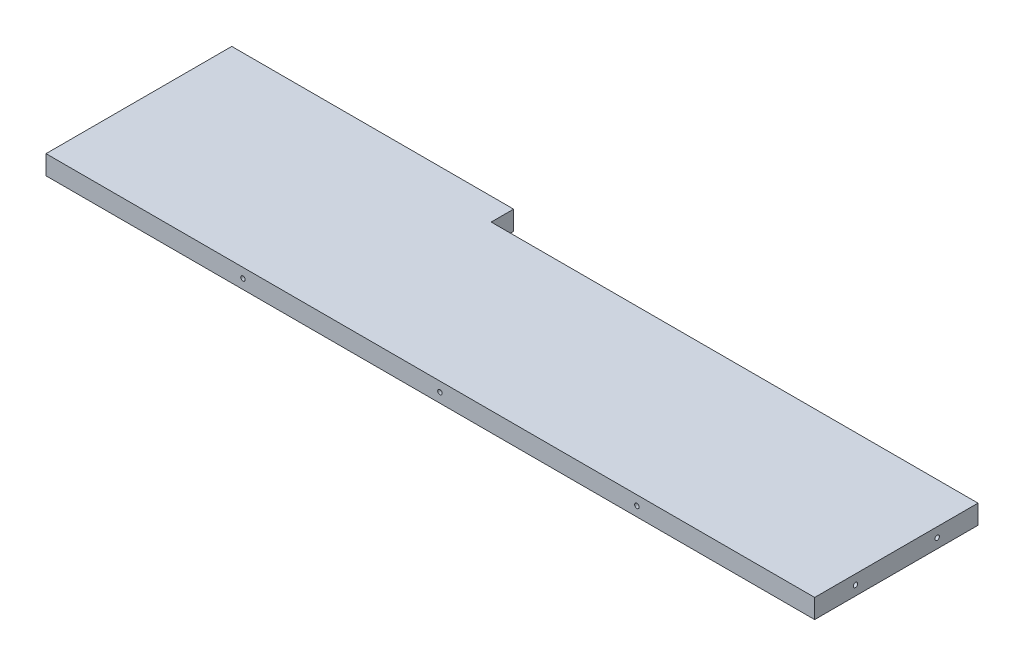
ISO-10303-21;
HEADER;
FILE_DESCRIPTION(('STEP AP214'),'2;1');
FILE_NAME('part.step','',(''),(''),'','','');
FILE_SCHEMA(('AUTOMOTIVE_DESIGN { 1 0 10303 214 1 1 1 1 }'));
ENDSEC;
DATA;
#1=APPLICATION_CONTEXT('core data for automotive mechanical design processes');
#2=APPLICATION_PROTOCOL_DEFINITION('international standard','automotive_design',2000,#1);
#3=PRODUCT_CONTEXT('',#1,'mechanical');
#4=PRODUCT('Part','Part','',(#3));
#5=PRODUCT_RELATED_PRODUCT_CATEGORY('part','',(#4));
#6=PRODUCT_DEFINITION_FORMATION('','',#4);
#7=PRODUCT_DEFINITION_CONTEXT('part definition',#1,'design');
#8=PRODUCT_DEFINITION('design','',#6,#7);
#9=PRODUCT_DEFINITION_SHAPE('','',#8);
#10=(LENGTH_UNIT() NAMED_UNIT(*) SI_UNIT(.MILLI.,.METRE.));
#11=(NAMED_UNIT(*) PLANE_ANGLE_UNIT() SI_UNIT($,.RADIAN.));
#12=(NAMED_UNIT(*) SI_UNIT($,.STERADIAN.) SOLID_ANGLE_UNIT());
#13=UNCERTAINTY_MEASURE_WITH_UNIT(LENGTH_MEASURE(1.E-05),#10,'distance_accuracy_value','');
#14=(GEOMETRIC_REPRESENTATION_CONTEXT(3) GLOBAL_UNCERTAINTY_ASSIGNED_CONTEXT((#13)) GLOBAL_UNIT_ASSIGNED_CONTEXT((#10,
#11,#12)) REPRESENTATION_CONTEXT('',''));
#15=CARTESIAN_POINT('',(0.,0.,0.));
#16=DIRECTION('',(0.,0.,1.));
#17=DIRECTION('',(1.,0.,0.));
#18=AXIS2_PLACEMENT_3D('',#15,#16,#17);
#19=CARTESIAN_POINT('',(-60.,3.,14.5));
#20=DIRECTION('',(-1.,0.,0.));
#21=DIRECTION('',(0.,0.,1.));
#22=AXIS2_PLACEMENT_3D('',#19,#20,#21);
#23=PLANE('',#22);
#24=DIRECTION('',(0.,0.,-1.));
#25=VECTOR('',#24,1.);
#26=CARTESIAN_POINT('',(-60.,0.,14.5));
#27=LINE('',#26,#25);
#28=CARTESIAN_POINT('',(-60.,0.,14.5));
#29=VERTEX_POINT('',#28);
#30=CARTESIAN_POINT('',(-60.,0.,-14.5));
#31=VERTEX_POINT('',#30);
#32=EDGE_CURVE('E126',#29,#31,#27,.T.);
#33=ORIENTED_EDGE('',*,*,#32,.F.);
#34=DIRECTION('',(0.,-1.,0.));
#35=VECTOR('',#34,1.);
#36=CARTESIAN_POINT('',(-60.,3.,14.5));
#37=LINE('',#36,#35);
#38=CARTESIAN_POINT('',(-60.,3.,14.5));
#39=VERTEX_POINT('',#38);
#40=EDGE_CURVE('E11',#39,#29,#37,.T.);
#41=ORIENTED_EDGE('',*,*,#40,.F.);
#42=DIRECTION('',(0.,0.,-1.));
#43=VECTOR('',#42,1.);
#44=CARTESIAN_POINT('',(-60.,3.,14.5));
#45=LINE('',#44,#43);
#46=CARTESIAN_POINT('',(-60.,3.,-14.5));
#47=VERTEX_POINT('',#46);
#48=EDGE_CURVE('E118',#39,#47,#45,.T.);
#49=ORIENTED_EDGE('',*,*,#48,.T.);
#50=DIRECTION('',(0.,-1.,0.));
#51=VECTOR('',#50,1.);
#52=CARTESIAN_POINT('',(-60.,3.,-14.5));
#53=LINE('',#52,#51);
#54=EDGE_CURVE('E42',#47,#31,#53,.T.);
#55=ORIENTED_EDGE('',*,*,#54,.T.);
#56=EDGE_LOOP('',(#33,#41,#49,#55));
#57=FACE_BOUND('',#56,.T.);
#58=ADVANCED_FACE('F39',(#57),#23,.T.);
#59=CARTESIAN_POINT('',(-60.,3.,14.5));
#60=DIRECTION('',(0.,0.,-1.));
#61=DIRECTION('',(-1.,0.,0.));
#62=AXIS2_PLACEMENT_3D('',#59,#60,#61);
#63=PLANE('',#62);
#64=CARTESIAN_POINT('',(-29.25,1.50000000000002,14.5));
#65=DIRECTION('',(0.,0.,1.));
#66=DIRECTION('',(1.,0.,0.));
#67=AXIS2_PLACEMENT_3D('',#64,#65,#66);
#68=CIRCLE('',#67,0.350000000000001);
#69=CARTESIAN_POINT('',(-28.9,1.50000000000002,14.5));
#70=VERTEX_POINT('',#69);
#71=EDGE_CURVE('E175',#70,#70,#68,.T.);
#72=ORIENTED_EDGE('',*,*,#71,.F.);
#73=EDGE_LOOP('',(#72));
#74=FACE_BOUND('',#73,.T.);
#75=CARTESIAN_POINT('',(1.50000000000004,1.50000000000002,14.5));
#76=DIRECTION('',(0.,0.,1.));
#77=DIRECTION('',(1.,0.,0.));
#78=AXIS2_PLACEMENT_3D('',#75,#76,#77);
#79=CIRCLE('',#78,0.35);
#80=CARTESIAN_POINT('',(1.85000000000004,1.50000000000002,14.5));
#81=VERTEX_POINT('',#80);
#82=EDGE_CURVE('E172',#81,#81,#79,.T.);
#83=ORIENTED_EDGE('',*,*,#82,.F.);
#84=EDGE_LOOP('',(#83));
#85=FACE_BOUND('',#84,.T.);
#86=CARTESIAN_POINT('',(32.25,1.50000000000002,14.5));
#87=DIRECTION('',(0.,0.,1.));
#88=DIRECTION('',(1.,0.,0.));
#89=AXIS2_PLACEMENT_3D('',#86,#87,#88);
#90=CIRCLE('',#89,0.350000000000001);
#91=CARTESIAN_POINT('',(32.6,1.50000000000002,14.5));
#92=VERTEX_POINT('',#91);
#93=EDGE_CURVE('E166',#92,#92,#90,.T.);
#94=ORIENTED_EDGE('',*,*,#93,.F.);
#95=EDGE_LOOP('',(#94));
#96=FACE_BOUND('',#95,.T.);
#97=DIRECTION('',(1.,0.,0.));
#98=VECTOR('',#97,1.);
#99=CARTESIAN_POINT('',(-60.,0.,14.5));
#100=LINE('',#99,#98);
#101=CARTESIAN_POINT('',(60.,0.,14.5));
#102=VERTEX_POINT('',#101);
#103=EDGE_CURVE('E122',#29,#102,#100,.T.);
#104=ORIENTED_EDGE('',*,*,#103,.T.);
#105=DIRECTION('',(0.,-1.,0.));
#106=VECTOR('',#105,1.);
#107=CARTESIAN_POINT('',(60.,3.,14.5));
#108=LINE('',#107,#106);
#109=CARTESIAN_POINT('',(60.,3.,14.5));
#110=VERTEX_POINT('',#109);
#111=EDGE_CURVE('E47',#110,#102,#108,.T.);
#112=ORIENTED_EDGE('',*,*,#111,.F.);
#113=DIRECTION('',(1.,0.,0.));
#114=VECTOR('',#113,1.);
#115=CARTESIAN_POINT('',(-60.,3.,14.5));
#116=LINE('',#115,#114);
#117=EDGE_CURVE('E120',#39,#110,#116,.T.);
#118=ORIENTED_EDGE('',*,*,#117,.F.);
#119=ORIENTED_EDGE('',*,*,#40,.T.);
#120=EDGE_LOOP('',(#104,#112,#118,#119));
#121=FACE_BOUND('',#120,.T.);
#122=ADVANCED_FACE('F142',(#74,#85,#96,#121),#63,.F.);
#123=CARTESIAN_POINT('',(60.,3.,14.5));
#124=DIRECTION('',(-1.,0.,0.));
#125=DIRECTION('',(0.,0.,1.));
#126=AXIS2_PLACEMENT_3D('',#123,#124,#125);
#127=PLANE('',#126);
#128=CARTESIAN_POINT('',(60.,1.50000000000007,8.12500000000002));
#129=DIRECTION('',(1.,0.,0.));
#130=DIRECTION('',(0.,0.,-1.));
#131=AXIS2_PLACEMENT_3D('',#128,#129,#130);
#132=CIRCLE('',#131,0.35);
#133=CARTESIAN_POINT('',(60.,1.50000000000007,7.77500000000002));
#134=VERTEX_POINT('',#133);
#135=EDGE_CURVE('E158',#134,#134,#132,.T.);
#136=ORIENTED_EDGE('',*,*,#135,.F.);
#137=EDGE_LOOP('',(#136));
#138=FACE_BOUND('',#137,.T.);
#139=CARTESIAN_POINT('',(60.,1.50000000000007,-4.62499999999998));
#140=DIRECTION('',(1.,0.,0.));
#141=DIRECTION('',(0.,0.,-1.));
#142=AXIS2_PLACEMENT_3D('',#139,#140,#141);
#143=CIRCLE('',#142,0.35);
#144=CARTESIAN_POINT('',(60.,1.50000000000007,-4.97499999999998));
#145=VERTEX_POINT('',#144);
#146=EDGE_CURVE('E154',#145,#145,#143,.T.);
#147=ORIENTED_EDGE('',*,*,#146,.F.);
#148=EDGE_LOOP('',(#147));
#149=FACE_BOUND('',#148,.T.);
#150=DIRECTION('',(0.,0.,-1.));
#151=VECTOR('',#150,1.);
#152=CARTESIAN_POINT('',(60.,0.,14.5));
#153=LINE('',#152,#151);
#154=CARTESIAN_POINT('',(60.,0.,-11.));
#155=VERTEX_POINT('',#154);
#156=EDGE_CURVE('E132',#102,#155,#153,.T.);
#157=ORIENTED_EDGE('',*,*,#156,.T.);
#158=DIRECTION('',(0.,-1.,0.));
#159=VECTOR('',#158,1.);
#160=CARTESIAN_POINT('',(60.,3.,-11.));
#161=LINE('',#160,#159);
#162=CARTESIAN_POINT('',(60.,3.,-11.));
#163=VERTEX_POINT('',#162);
#164=EDGE_CURVE('E55',#163,#155,#161,.T.);
#165=ORIENTED_EDGE('',*,*,#164,.F.);
#166=DIRECTION('',(0.,0.,-1.));
#167=VECTOR('',#166,1.);
#168=CARTESIAN_POINT('',(60.,3.,14.5));
#169=LINE('',#168,#167);
#170=EDGE_CURVE('E117',#110,#163,#169,.T.);
#171=ORIENTED_EDGE('',*,*,#170,.F.);
#172=ORIENTED_EDGE('',*,*,#111,.T.);
#173=EDGE_LOOP('',(#157,#165,#171,#172));
#174=FACE_BOUND('',#173,.T.);
#175=ADVANCED_FACE('F143',(#138,#149,#174),#127,.F.);
#176=CARTESIAN_POINT('',(-60.,3.,-14.5));
#177=DIRECTION('',(0.,0.,-1.));
#178=DIRECTION('',(-1.,0.,0.));
#179=AXIS2_PLACEMENT_3D('',#176,#177,#178);
#180=PLANE('',#179);
#181=DIRECTION('',(0.,-1.,0.));
#182=VECTOR('',#181,1.);
#183=CARTESIAN_POINT('',(-16.,3.,-14.5));
#184=LINE('',#183,#182);
#185=CARTESIAN_POINT('',(-16.,3.,-14.5));
#186=VERTEX_POINT('',#185);
#187=CARTESIAN_POINT('',(-16.,0.,-14.5));
#188=VERTEX_POINT('',#187);
#189=EDGE_CURVE('E99',#186,#188,#184,.T.);
#190=ORIENTED_EDGE('',*,*,#189,.T.);
#191=DIRECTION('',(1.,0.,0.));
#192=VECTOR('',#191,1.);
#193=CARTESIAN_POINT('',(-60.,0.,-14.5));
#194=LINE('',#193,#192);
#195=EDGE_CURVE('E129',#31,#188,#194,.T.);
#196=ORIENTED_EDGE('',*,*,#195,.F.);
#197=ORIENTED_EDGE('',*,*,#54,.F.);
#198=DIRECTION('',(1.,0.,0.));
#199=VECTOR('',#198,1.);
#200=CARTESIAN_POINT('',(-60.,3.,-14.5));
#201=LINE('',#200,#199);
#202=EDGE_CURVE('E112',#47,#186,#201,.T.);
#203=ORIENTED_EDGE('',*,*,#202,.T.);
#204=EDGE_LOOP('',(#190,#196,#197,#203));
#205=FACE_BOUND('',#204,.T.);
#206=ADVANCED_FACE('F116',(#205),#180,.T.);
#207=CARTESIAN_POINT('',(0.,3.,0.));
#208=DIRECTION('',(0.,-1.,0.));
#209=DIRECTION('',(0.,0.,-1.));
#210=AXIS2_PLACEMENT_3D('',#207,#208,#209);
#211=PLANE('',#210);
#212=DIRECTION('',(-1.,0.,0.));
#213=VECTOR('',#212,1.);
#214=CARTESIAN_POINT('',(-16.,3.,-11.));
#215=LINE('',#214,#213);
#216=CARTESIAN_POINT('',(-16.,3.,-11.));
#217=VERTEX_POINT('',#216);
#218=EDGE_CURVE('E107',#163,#217,#215,.T.);
#219=ORIENTED_EDGE('',*,*,#218,.T.);
#220=DIRECTION('',(0.,0.,-1.));
#221=VECTOR('',#220,1.);
#222=CARTESIAN_POINT('',(-16.,3.,-11.));
#223=LINE('',#222,#221);
#224=EDGE_CURVE('E102',#217,#186,#223,.T.);
#225=ORIENTED_EDGE('',*,*,#224,.T.);
#226=ORIENTED_EDGE('',*,*,#202,.F.);
#227=ORIENTED_EDGE('',*,*,#48,.F.);
#228=ORIENTED_EDGE('',*,*,#117,.T.);
#229=ORIENTED_EDGE('',*,*,#170,.T.);
#230=EDGE_LOOP('',(#219,#225,#226,#227,#228,#229));
#231=FACE_BOUND('',#230,.T.);
#232=ADVANCED_FACE('F110',(#231),#211,.F.);
#233=CARTESIAN_POINT('',(0.,0.,0.));
#234=DIRECTION('',(0.,-1.,0.));
#235=DIRECTION('',(0.,0.,-1.));
#236=AXIS2_PLACEMENT_3D('',#233,#234,#235);
#237=PLANE('',#236);
#238=DIRECTION('',(0.,0.,-1.));
#239=VECTOR('',#238,1.);
#240=CARTESIAN_POINT('',(-16.,0.,-11.));
#241=LINE('',#240,#239);
#242=CARTESIAN_POINT('',(-16.,0.,-11.));
#243=VERTEX_POINT('',#242);
#244=EDGE_CURVE('E105',#243,#188,#241,.T.);
#245=ORIENTED_EDGE('',*,*,#244,.F.);
#246=DIRECTION('',(-1.,0.,0.));
#247=VECTOR('',#246,1.);
#248=CARTESIAN_POINT('',(-16.,0.,-11.));
#249=LINE('',#248,#247);
#250=EDGE_CURVE('E114',#155,#243,#249,.T.);
#251=ORIENTED_EDGE('',*,*,#250,.F.);
#252=ORIENTED_EDGE('',*,*,#156,.F.);
#253=ORIENTED_EDGE('',*,*,#103,.F.);
#254=ORIENTED_EDGE('',*,*,#32,.T.);
#255=ORIENTED_EDGE('',*,*,#195,.T.);
#256=EDGE_LOOP('',(#245,#251,#252,#253,#254,#255));
#257=FACE_BOUND('',#256,.T.);
#258=ADVANCED_FACE('F141',(#257),#237,.T.);
#259=CARTESIAN_POINT('',(-16.,3.,-11.));
#260=DIRECTION('',(-1.,0.,0.));
#261=DIRECTION('',(0.,0.,1.));
#262=AXIS2_PLACEMENT_3D('',#259,#260,#261);
#263=PLANE('',#262);
#264=ORIENTED_EDGE('',*,*,#244,.T.);
#265=ORIENTED_EDGE('',*,*,#189,.F.);
#266=ORIENTED_EDGE('',*,*,#224,.F.);
#267=DIRECTION('',(0.,-1.,0.));
#268=VECTOR('',#267,1.);
#269=CARTESIAN_POINT('',(-16.,3.,-11.));
#270=LINE('',#269,#268);
#271=EDGE_CURVE('E130',#217,#243,#270,.T.);
#272=ORIENTED_EDGE('',*,*,#271,.T.);
#273=EDGE_LOOP('',(#264,#265,#266,#272));
#274=FACE_BOUND('',#273,.T.);
#275=ADVANCED_FACE('F101',(#274),#263,.F.);
#276=CARTESIAN_POINT('',(-16.,3.,-11.));
#277=DIRECTION('',(0.,0.,1.));
#278=DIRECTION('',(1.,0.,0.));
#279=AXIS2_PLACEMENT_3D('',#276,#277,#278);
#280=PLANE('',#279);
#281=ORIENTED_EDGE('',*,*,#250,.T.);
#282=ORIENTED_EDGE('',*,*,#271,.F.);
#283=ORIENTED_EDGE('',*,*,#218,.F.);
#284=ORIENTED_EDGE('',*,*,#164,.T.);
#285=EDGE_LOOP('',(#281,#282,#283,#284));
#286=FACE_BOUND('',#285,.T.);
#287=ADVANCED_FACE('F261',(#286),#280,.F.);
#288=CARTESIAN_POINT('',(57.,1.50000000000007,-4.62499999999998));
#289=DIRECTION('',(1.,0.,0.));
#290=DIRECTION('',(0.,0.,-1.));
#291=AXIS2_PLACEMENT_3D('',#288,#289,#290);
#292=CYLINDRICAL_SURFACE('',#291,0.35);
#293=CARTESIAN_POINT('',(57.,1.50000000000007,-4.62499999999998));
#294=DIRECTION('',(1.,0.,0.));
#295=DIRECTION('',(0.,0.,-1.));
#296=AXIS2_PLACEMENT_3D('',#293,#294,#295);
#297=CIRCLE('',#296,0.35);
#298=CARTESIAN_POINT('',(57.,1.50000000000007,-4.97499999999998));
#299=VERTEX_POINT('',#298);
#300=EDGE_CURVE('E151',#299,#299,#297,.T.);
#301=ORIENTED_EDGE('',*,*,#300,.F.);
#302=EDGE_LOOP('',(#301));
#303=FACE_BOUND('',#302,.T.);
#304=ORIENTED_EDGE('',*,*,#146,.T.);
#305=EDGE_LOOP('',(#304));
#306=FACE_BOUND('',#305,.T.);
#307=ADVANCED_FACE('F267',(#303,#306),#292,.F.);
#308=CARTESIAN_POINT('',(57.,1.50000000000007,-4.62499999999998));
#309=DIRECTION('',(1.,0.,0.));
#310=DIRECTION('',(0.,0.,-1.));
#311=AXIS2_PLACEMENT_3D('',#308,#309,#310);
#312=PLANE('',#311);
#313=ORIENTED_EDGE('',*,*,#300,.T.);
#314=EDGE_LOOP('',(#313));
#315=FACE_BOUND('',#314,.T.);
#316=ADVANCED_FACE('F273',(#315),#312,.T.);
#317=CARTESIAN_POINT('',(57.,1.50000000000007,8.12500000000002));
#318=DIRECTION('',(1.,0.,0.));
#319=DIRECTION('',(0.,0.,-1.));
#320=AXIS2_PLACEMENT_3D('',#317,#318,#319);
#321=CYLINDRICAL_SURFACE('',#320,0.35);
#322=CARTESIAN_POINT('',(57.,1.50000000000007,8.12500000000002));
#323=DIRECTION('',(1.,0.,0.));
#324=DIRECTION('',(0.,0.,-1.));
#325=AXIS2_PLACEMENT_3D('',#322,#323,#324);
#326=CIRCLE('',#325,0.35);
#327=CARTESIAN_POINT('',(57.,1.50000000000007,7.77500000000002));
#328=VERTEX_POINT('',#327);
#329=EDGE_CURVE('E149',#328,#328,#326,.T.);
#330=ORIENTED_EDGE('',*,*,#329,.F.);
#331=EDGE_LOOP('',(#330));
#332=FACE_BOUND('',#331,.T.);
#333=ORIENTED_EDGE('',*,*,#135,.T.);
#334=EDGE_LOOP('',(#333));
#335=FACE_BOUND('',#334,.T.);
#336=ADVANCED_FACE('F210',(#332,#335),#321,.F.);
#337=CARTESIAN_POINT('',(57.,1.50000000000007,8.12500000000002));
#338=DIRECTION('',(1.,0.,0.));
#339=DIRECTION('',(0.,0.,-1.));
#340=AXIS2_PLACEMENT_3D('',#337,#338,#339);
#341=PLANE('',#340);
#342=ORIENTED_EDGE('',*,*,#329,.T.);
#343=EDGE_LOOP('',(#342));
#344=FACE_BOUND('',#343,.T.);
#345=ADVANCED_FACE('F200',(#344),#341,.T.);
#346=CARTESIAN_POINT('',(32.25,1.50000000000002,11.5));
#347=DIRECTION('',(0.,0.,1.));
#348=DIRECTION('',(1.,0.,0.));
#349=AXIS2_PLACEMENT_3D('',#346,#347,#348);
#350=CYLINDRICAL_SURFACE('',#349,0.350000000000001);
#351=CARTESIAN_POINT('',(32.25,1.50000000000002,11.5));
#352=DIRECTION('',(0.,0.,1.));
#353=DIRECTION('',(1.,0.,0.));
#354=AXIS2_PLACEMENT_3D('',#351,#352,#353);
#355=CIRCLE('',#354,0.350000000000001);
#356=CARTESIAN_POINT('',(32.6,1.50000000000002,11.5));
#357=VERTEX_POINT('',#356);
#358=EDGE_CURVE('E163',#357,#357,#355,.T.);
#359=ORIENTED_EDGE('',*,*,#358,.F.);
#360=EDGE_LOOP('',(#359));
#361=FACE_BOUND('',#360,.T.);
#362=ORIENTED_EDGE('',*,*,#93,.T.);
#363=EDGE_LOOP('',(#362));
#364=FACE_BOUND('',#363,.T.);
#365=ADVANCED_FACE('F197',(#361,#364),#350,.F.);
#366=CARTESIAN_POINT('',(32.25,1.50000000000002,11.5));
#367=DIRECTION('',(0.,0.,1.));
#368=DIRECTION('',(1.,0.,0.));
#369=AXIS2_PLACEMENT_3D('',#366,#367,#368);
#370=PLANE('',#369);
#371=ORIENTED_EDGE('',*,*,#358,.T.);
#372=EDGE_LOOP('',(#371));
#373=FACE_BOUND('',#372,.T.);
#374=ADVANCED_FACE('F199',(#373),#370,.T.);
#375=CARTESIAN_POINT('',(1.50000000000004,1.50000000000002,11.5));
#376=DIRECTION('',(0.,0.,1.));
#377=DIRECTION('',(1.,0.,0.));
#378=AXIS2_PLACEMENT_3D('',#375,#376,#377);
#379=CYLINDRICAL_SURFACE('',#378,0.35);
#380=CARTESIAN_POINT('',(1.50000000000004,1.50000000000002,11.5));
#381=DIRECTION('',(0.,0.,1.));
#382=DIRECTION('',(1.,0.,0.));
#383=AXIS2_PLACEMENT_3D('',#380,#381,#382);
#384=CIRCLE('',#383,0.35);
#385=CARTESIAN_POINT('',(1.85000000000004,1.50000000000002,11.5));
#386=VERTEX_POINT('',#385);
#387=EDGE_CURVE('E169',#386,#386,#384,.T.);
#388=ORIENTED_EDGE('',*,*,#387,.F.);
#389=EDGE_LOOP('',(#388));
#390=FACE_BOUND('',#389,.T.);
#391=ORIENTED_EDGE('',*,*,#82,.T.);
#392=EDGE_LOOP('',(#391));
#393=FACE_BOUND('',#392,.T.);
#394=ADVANCED_FACE('F207',(#390,#393),#379,.F.);
#395=CARTESIAN_POINT('',(1.50000000000004,1.50000000000002,11.5));
#396=DIRECTION('',(0.,0.,1.));
#397=DIRECTION('',(1.,0.,0.));
#398=AXIS2_PLACEMENT_3D('',#395,#396,#397);
#399=PLANE('',#398);
#400=ORIENTED_EDGE('',*,*,#387,.T.);
#401=EDGE_LOOP('',(#400));
#402=FACE_BOUND('',#401,.T.);
#403=ADVANCED_FACE('F186',(#402),#399,.T.);
#404=CARTESIAN_POINT('',(-29.25,1.50000000000002,11.5));
#405=DIRECTION('',(0.,0.,1.));
#406=DIRECTION('',(1.,0.,0.));
#407=AXIS2_PLACEMENT_3D('',#404,#405,#406);
#408=CYLINDRICAL_SURFACE('',#407,0.350000000000001);
#409=CARTESIAN_POINT('',(-29.25,1.50000000000002,11.5));
#410=DIRECTION('',(0.,0.,1.));
#411=DIRECTION('',(1.,0.,0.));
#412=AXIS2_PLACEMENT_3D('',#409,#410,#411);
#413=CIRCLE('',#412,0.350000000000001);
#414=CARTESIAN_POINT('',(-28.9,1.50000000000002,11.5));
#415=VERTEX_POINT('',#414);
#416=EDGE_CURVE('E155',#415,#415,#413,.T.);
#417=ORIENTED_EDGE('',*,*,#416,.F.);
#418=EDGE_LOOP('',(#417));
#419=FACE_BOUND('',#418,.T.);
#420=ORIENTED_EDGE('',*,*,#71,.T.);
#421=EDGE_LOOP('',(#420));
#422=FACE_BOUND('',#421,.T.);
#423=ADVANCED_FACE('F183',(#419,#422),#408,.F.);
#424=CARTESIAN_POINT('',(-29.25,1.50000000000002,11.5));
#425=DIRECTION('',(0.,0.,1.));
#426=DIRECTION('',(1.,0.,0.));
#427=AXIS2_PLACEMENT_3D('',#424,#425,#426);
#428=PLANE('',#427);
#429=ORIENTED_EDGE('',*,*,#416,.T.);
#430=EDGE_LOOP('',(#429));
#431=FACE_BOUND('',#430,.T.);
#432=ADVANCED_FACE('F181',(#431),#428,.T.);
#433=CLOSED_SHELL('',(#58,#122,#175,#206,#232,#258,#275,#287,#307,#316,#336,#345,#365,#374,#394,
#403,#423,#432));
#434=MANIFOLD_SOLID_BREP('B2',#433);
#435=ADVANCED_BREP_SHAPE_REPRESENTATION('',(#18,#434),#14);
#436=SHAPE_DEFINITION_REPRESENTATION(#9,#435);
ENDSEC;
END-ISO-10303-21;
